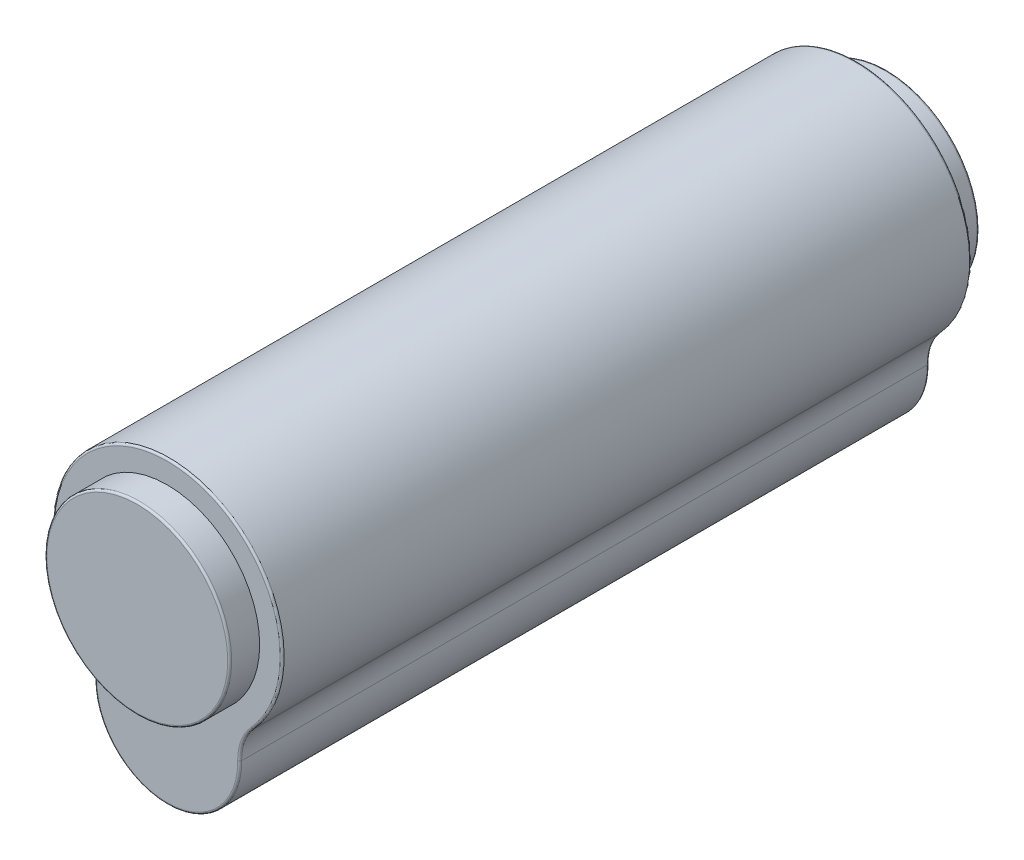
ISO-10303-21;
HEADER;
FILE_DESCRIPTION(('STEP AP214'),'2;1');
FILE_NAME('part.step','',(''),(''),'','','');
FILE_SCHEMA(('AUTOMOTIVE_DESIGN { 1 0 10303 214 1 1 1 1 }'));
ENDSEC;
DATA;
#1=APPLICATION_CONTEXT('core data for automotive mechanical design processes');
#2=APPLICATION_PROTOCOL_DEFINITION('international standard','automotive_design',2000,#1);
#3=PRODUCT_CONTEXT('',#1,'mechanical');
#4=PRODUCT('Part','Part','',(#3));
#5=PRODUCT_RELATED_PRODUCT_CATEGORY('part','',(#4));
#6=PRODUCT_DEFINITION_FORMATION('','',#4);
#7=PRODUCT_DEFINITION_CONTEXT('part definition',#1,'design');
#8=PRODUCT_DEFINITION('design','',#6,#7);
#9=PRODUCT_DEFINITION_SHAPE('','',#8);
#10=(LENGTH_UNIT() NAMED_UNIT(*) SI_UNIT(.MILLI.,.METRE.));
#11=(NAMED_UNIT(*) PLANE_ANGLE_UNIT() SI_UNIT($,.RADIAN.));
#12=(NAMED_UNIT(*) SI_UNIT($,.STERADIAN.) SOLID_ANGLE_UNIT());
#13=UNCERTAINTY_MEASURE_WITH_UNIT(LENGTH_MEASURE(1.E-05),#10,'distance_accuracy_value','');
#14=(GEOMETRIC_REPRESENTATION_CONTEXT(3) GLOBAL_UNCERTAINTY_ASSIGNED_CONTEXT((#13)) GLOBAL_UNIT_ASSIGNED_CONTEXT((#10,
#11,#12)) REPRESENTATION_CONTEXT('',''));
#15=CARTESIAN_POINT('',(0.,0.,0.));
#16=DIRECTION('',(0.,0.,1.));
#17=DIRECTION('',(1.,0.,0.));
#18=AXIS2_PLACEMENT_3D('',#15,#16,#17);
#19=CARTESIAN_POINT('',(-6.12422834645363,-5.52777777777778,0.));
#20=DIRECTION('',(0.,0.,1.));
#21=DIRECTION('',(1.,0.,0.));
#22=AXIS2_PLACEMENT_3D('',#19,#20,#21);
#23=PLANE('',#22);
#24=CARTESIAN_POINT('',(0.,0.,0.));
#25=DIRECTION('',(0.,0.,1.));
#26=DIRECTION('',(1.,0.,0.));
#27=AXIS2_PLACEMENT_3D('',#24,#25,#26);
#28=CIRCLE('',#27,11.3);
#29=CARTESIAN_POINT('',(-8.38833700786982,-7.57138047138047,0.));
#30=VERTEX_POINT('',#29);
#31=CARTESIAN_POINT('',(8.38833700786982,-7.57138047138047,0.));
#32=VERTEX_POINT('',#31);
#33=EDGE_CURVE('E253',#30,#32,#28,.F.);
#34=ORIENTED_EDGE('',*,*,#33,.T.);
#35=CARTESIAN_POINT('',(12.2484566929073,-11.0555555555556,0.));
#36=DIRECTION('',(0.,0.,1.));
#37=DIRECTION('',(1.,0.,0.));
#38=AXIS2_PLACEMENT_3D('',#35,#36,#37);
#39=CIRCLE('',#38,5.2);
#40=CARTESIAN_POINT('',(7.0491118110201,-11.1380952380952,0.));
#41=VERTEX_POINT('',#40);
#42=EDGE_CURVE('E259',#32,#41,#39,.T.);
#43=ORIENTED_EDGE('',*,*,#42,.T.);
#44=CARTESIAN_POINT('',(0.,-11.25,0.));
#45=DIRECTION('',(0.,0.,1.));
#46=DIRECTION('',(1.,0.,0.));
#47=AXIS2_PLACEMENT_3D('',#44,#45,#46);
#48=CIRCLE('',#47,7.05);
#49=CARTESIAN_POINT('',(-7.04911181102009,-11.1380952380952,0.));
#50=VERTEX_POINT('',#49);
#51=EDGE_CURVE('E257',#41,#50,#48,.F.);
#52=ORIENTED_EDGE('',*,*,#51,.T.);
#53=CARTESIAN_POINT('',(-12.2484566929073,-11.0555555555556,0.));
#54=DIRECTION('',(0.,0.,1.));
#55=DIRECTION('',(1.,0.,0.));
#56=AXIS2_PLACEMENT_3D('',#53,#54,#55);
#57=CIRCLE('',#56,5.2);
#58=EDGE_CURVE('E255',#50,#30,#57,.T.);
#59=ORIENTED_EDGE('',*,*,#58,.T.);
#60=EDGE_LOOP('',(#34,#43,#52,#59));
#61=FACE_BOUND('',#60,.T.);
#62=CARTESIAN_POINT('',(0.,0.,0.));
#63=DIRECTION('',(0.,0.,1.));
#64=DIRECTION('',(1.,0.,0.));
#65=AXIS2_PLACEMENT_3D('',#62,#63,#64);
#66=CIRCLE('',#65,9.25);
#67=CARTESIAN_POINT('',(9.25,0.,0.));
#68=VERTEX_POINT('',#67);
#69=EDGE_CURVE('E170',#68,#68,#66,.F.);
#70=ORIENTED_EDGE('',*,*,#69,.F.);
#71=EDGE_LOOP('',(#70));
#72=FACE_BOUND('',#71,.T.);
#73=ADVANCED_FACE('F35',(#61,#72),#23,.F.);
#74=CARTESIAN_POINT('',(-6.12422834645363,-5.52777777777778,69.));
#75=DIRECTION('',(0.,0.,1.));
#76=DIRECTION('',(1.,0.,0.));
#77=AXIS2_PLACEMENT_3D('',#74,#75,#76);
#78=PLANE('',#77);
#79=CARTESIAN_POINT('',(0.,-11.25,69.));
#80=DIRECTION('',(0.,0.,1.));
#81=DIRECTION('',(1.,0.,0.));
#82=AXIS2_PLACEMENT_3D('',#79,#80,#81);
#83=CIRCLE('',#82,7.05);
#84=CARTESIAN_POINT('',(-7.04911181102009,-11.1380952380952,69.));
#85=VERTEX_POINT('',#84);
#86=CARTESIAN_POINT('',(7.0491118110201,-11.1380952380952,69.));
#87=VERTEX_POINT('',#86);
#88=EDGE_CURVE('E86',#85,#87,#83,.T.);
#89=ORIENTED_EDGE('',*,*,#88,.T.);
#90=CARTESIAN_POINT('',(12.2484566929073,-11.0555555555556,69.));
#91=DIRECTION('',(0.,0.,1.));
#92=DIRECTION('',(1.,0.,0.));
#93=AXIS2_PLACEMENT_3D('',#90,#91,#92);
#94=CIRCLE('',#93,5.2);
#95=CARTESIAN_POINT('',(8.38833700786982,-7.57138047138047,69.));
#96=VERTEX_POINT('',#95);
#97=EDGE_CURVE('E273',#87,#96,#94,.F.);
#98=ORIENTED_EDGE('',*,*,#97,.T.);
#99=CARTESIAN_POINT('',(0.,0.,69.));
#100=DIRECTION('',(0.,0.,1.));
#101=DIRECTION('',(1.,0.,0.));
#102=AXIS2_PLACEMENT_3D('',#99,#100,#101);
#103=CIRCLE('',#102,11.3);
#104=CARTESIAN_POINT('',(-8.38833700786982,-7.57138047138047,69.));
#105=VERTEX_POINT('',#104);
#106=EDGE_CURVE('E173',#96,#105,#103,.T.);
#107=ORIENTED_EDGE('',*,*,#106,.T.);
#108=CARTESIAN_POINT('',(-12.2484566929073,-11.0555555555556,69.));
#109=DIRECTION('',(0.,0.,1.));
#110=DIRECTION('',(1.,0.,0.));
#111=AXIS2_PLACEMENT_3D('',#108,#109,#110);
#112=CIRCLE('',#111,5.2);
#113=EDGE_CURVE('E91',#105,#85,#112,.F.);
#114=ORIENTED_EDGE('',*,*,#113,.T.);
#115=EDGE_LOOP('',(#89,#98,#107,#114));
#116=FACE_BOUND('',#115,.T.);
#117=CARTESIAN_POINT('',(0.,0.,69.));
#118=DIRECTION('',(0.,0.,1.));
#119=DIRECTION('',(1.,0.,0.));
#120=AXIS2_PLACEMENT_3D('',#117,#118,#119);
#121=CIRCLE('',#120,9.25);
#122=CARTESIAN_POINT('',(9.25,0.,69.));
#123=VERTEX_POINT('',#122);
#124=EDGE_CURVE('E161',#123,#123,#121,.T.);
#125=ORIENTED_EDGE('',*,*,#124,.F.);
#126=EDGE_LOOP('',(#125));
#127=FACE_BOUND('',#126,.T.);
#128=ADVANCED_FACE('F296',(#116,#127),#78,.T.);
#129=CARTESIAN_POINT('',(0.,0.,69.));
#130=DIRECTION('',(0.,0.,-1.));
#131=DIRECTION('',(-1.,0.,0.));
#132=AXIS2_PLACEMENT_3D('',#129,#130,#131);
#133=CYLINDRICAL_SURFACE('',#132,11.5);
#134=DIRECTION('',(0.,0.,-1.));
#135=VECTOR('',#134,1.);
#136=CARTESIAN_POINT('',(8.53680314960203,-7.70538720538721,69.));
#137=LINE('',#136,#135);
#138=CARTESIAN_POINT('',(8.53680314960203,-7.70538720538721,68.8));
#139=VERTEX_POINT('',#138);
#140=CARTESIAN_POINT('',(8.53680314960203,-7.70538720538721,0.200000000000006));
#141=VERTEX_POINT('',#140);
#142=EDGE_CURVE('E140',#139,#141,#137,.T.);
#143=ORIENTED_EDGE('',*,*,#142,.T.);
#144=CARTESIAN_POINT('',(0.,0.,0.200000000000006));
#145=DIRECTION('',(0.,0.,1.));
#146=DIRECTION('',(1.,0.,0.));
#147=AXIS2_PLACEMENT_3D('',#144,#145,#146);
#148=CIRCLE('',#147,11.5);
#149=CARTESIAN_POINT('',(-8.53680314960203,-7.70538720538721,0.200000000000006));
#150=VERTEX_POINT('',#149);
#151=EDGE_CURVE('E147',#141,#150,#148,.T.);
#152=ORIENTED_EDGE('',*,*,#151,.T.);
#153=DIRECTION('',(0.,0.,-1.));
#154=VECTOR('',#153,1.);
#155=CARTESIAN_POINT('',(-8.53680314960203,-7.70538720538721,69.));
#156=LINE('',#155,#154);
#157=CARTESIAN_POINT('',(-8.53680314960203,-7.70538720538721,68.8));
#158=VERTEX_POINT('',#157);
#159=EDGE_CURVE('E142',#158,#150,#156,.T.);
#160=ORIENTED_EDGE('',*,*,#159,.F.);
#161=CARTESIAN_POINT('',(0.,0.,68.8));
#162=DIRECTION('',(0.,0.,1.));
#163=DIRECTION('',(1.,0.,0.));
#164=AXIS2_PLACEMENT_3D('',#161,#162,#163);
#165=CIRCLE('',#164,11.5);
#166=EDGE_CURVE('E137',#158,#139,#165,.F.);
#167=ORIENTED_EDGE('',*,*,#166,.T.);
#168=EDGE_LOOP('',(#143,#152,#160,#167));
#169=FACE_BOUND('',#168,.T.);
#170=ADVANCED_FACE('F139',(#169),#133,.T.);
#171=CARTESIAN_POINT('',(-12.2484566929073,-11.0555555555556,69.));
#172=DIRECTION('',(0.,0.,-1.));
#173=DIRECTION('',(-1.,0.,0.));
#174=AXIS2_PLACEMENT_3D('',#171,#172,#173);
#175=CYLINDRICAL_SURFACE('',#174,5.);
#176=ORIENTED_EDGE('',*,*,#159,.T.);
#177=CARTESIAN_POINT('',(-12.2484566929073,-11.0555555555556,0.200000000000006));
#178=DIRECTION('',(0.,0.,1.));
#179=DIRECTION('',(1.,0.,0.));
#180=AXIS2_PLACEMENT_3D('',#177,#178,#179);
#181=CIRCLE('',#180,5.);
#182=CARTESIAN_POINT('',(-7.2490866141696,-11.1349206349206,0.200000000000006));
#183=VERTEX_POINT('',#182);
#184=EDGE_CURVE('E268',#150,#183,#181,.F.);
#185=ORIENTED_EDGE('',*,*,#184,.T.);
#186=DIRECTION('',(0.,0.,-1.));
#187=VECTOR('',#186,1.);
#188=CARTESIAN_POINT('',(-7.2490866141696,-11.1349206349206,69.));
#189=LINE('',#188,#187);
#190=CARTESIAN_POINT('',(-7.2490866141696,-11.1349206349206,68.8));
#191=VERTEX_POINT('',#190);
#192=EDGE_CURVE('E246',#191,#183,#189,.T.);
#193=ORIENTED_EDGE('',*,*,#192,.F.);
#194=CARTESIAN_POINT('',(-12.2484566929073,-11.0555555555556,68.8));
#195=DIRECTION('',(0.,0.,1.));
#196=DIRECTION('',(1.,0.,0.));
#197=AXIS2_PLACEMENT_3D('',#194,#195,#196);
#198=CIRCLE('',#197,5.);
#199=EDGE_CURVE('E266',#191,#158,#198,.T.);
#200=ORIENTED_EDGE('',*,*,#199,.T.);
#201=EDGE_LOOP('',(#176,#185,#193,#200));
#202=FACE_BOUND('',#201,.T.);
#203=ADVANCED_FACE('F282',(#202),#175,.F.);
#204=CARTESIAN_POINT('',(0.,-11.25,69.));
#205=DIRECTION('',(0.,0.,-1.));
#206=DIRECTION('',(-1.,0.,0.));
#207=AXIS2_PLACEMENT_3D('',#204,#205,#206);
#208=CYLINDRICAL_SURFACE('',#207,7.25);
#209=ORIENTED_EDGE('',*,*,#192,.T.);
#210=CARTESIAN_POINT('',(0.,-11.25,0.200000000000006));
#211=DIRECTION('',(0.,0.,1.));
#212=DIRECTION('',(1.,0.,0.));
#213=AXIS2_PLACEMENT_3D('',#210,#211,#212);
#214=CIRCLE('',#213,7.25);
#215=CARTESIAN_POINT('',(7.2490866141696,-11.1349206349206,0.200000000000006));
#216=VERTEX_POINT('',#215);
#217=EDGE_CURVE('E264',#183,#216,#214,.T.);
#218=ORIENTED_EDGE('',*,*,#217,.T.);
#219=DIRECTION('',(0.,0.,-1.));
#220=VECTOR('',#219,1.);
#221=CARTESIAN_POINT('',(7.2490866141696,-11.1349206349206,69.));
#222=LINE('',#221,#220);
#223=CARTESIAN_POINT('',(7.2490866141696,-11.1349206349206,68.8));
#224=VERTEX_POINT('',#223);
#225=EDGE_CURVE('E160',#224,#216,#222,.T.);
#226=ORIENTED_EDGE('',*,*,#225,.F.);
#227=CARTESIAN_POINT('',(0.,-11.25,68.8));
#228=DIRECTION('',(0.,0.,1.));
#229=DIRECTION('',(1.,0.,0.));
#230=AXIS2_PLACEMENT_3D('',#227,#228,#229);
#231=CIRCLE('',#230,7.25);
#232=EDGE_CURVE('E262',#224,#191,#231,.F.);
#233=ORIENTED_EDGE('',*,*,#232,.T.);
#234=EDGE_LOOP('',(#209,#218,#226,#233));
#235=FACE_BOUND('',#234,.T.);
#236=ADVANCED_FACE('F291',(#235),#208,.T.);
#237=CARTESIAN_POINT('',(12.2484566929073,-11.0555555555556,69.));
#238=DIRECTION('',(0.,0.,-1.));
#239=DIRECTION('',(-1.,0.,0.));
#240=AXIS2_PLACEMENT_3D('',#237,#238,#239);
#241=CYLINDRICAL_SURFACE('',#240,5.);
#242=ORIENTED_EDGE('',*,*,#225,.T.);
#243=CARTESIAN_POINT('',(12.2484566929073,-11.0555555555556,0.200000000000006));
#244=DIRECTION('',(0.,0.,1.));
#245=DIRECTION('',(1.,0.,0.));
#246=AXIS2_PLACEMENT_3D('',#243,#244,#245);
#247=CIRCLE('',#246,5.);
#248=EDGE_CURVE('E159',#216,#141,#247,.F.);
#249=ORIENTED_EDGE('',*,*,#248,.T.);
#250=ORIENTED_EDGE('',*,*,#142,.F.);
#251=CARTESIAN_POINT('',(12.2484566929073,-11.0555555555556,68.8));
#252=DIRECTION('',(0.,0.,1.));
#253=DIRECTION('',(1.,0.,0.));
#254=AXIS2_PLACEMENT_3D('',#251,#252,#253);
#255=CIRCLE('',#254,5.);
#256=EDGE_CURVE('E156',#139,#224,#255,.T.);
#257=ORIENTED_EDGE('',*,*,#256,.T.);
#258=EDGE_LOOP('',(#242,#249,#250,#257));
#259=FACE_BOUND('',#258,.T.);
#260=ADVANCED_FACE('F155',(#259),#241,.F.);
#261=CARTESIAN_POINT('',(0.,0.,72.));
#262=DIRECTION('',(0.,0.,-1.));
#263=DIRECTION('',(-1.,0.,0.));
#264=AXIS2_PLACEMENT_3D('',#261,#262,#263);
#265=CYLINDRICAL_SURFACE('',#264,9.25);
#266=CARTESIAN_POINT('',(0.,0.,71.8));
#267=DIRECTION('',(0.,0.,1.));
#268=DIRECTION('',(1.,0.,0.));
#269=AXIS2_PLACEMENT_3D('',#266,#267,#268);
#270=CIRCLE('',#269,9.25);
#271=CARTESIAN_POINT('',(9.25,0.,71.8));
#272=VERTEX_POINT('',#271);
#273=EDGE_CURVE('E217',#272,#272,#270,.F.);
#274=ORIENTED_EDGE('',*,*,#273,.T.);
#275=EDGE_LOOP('',(#274));
#276=FACE_BOUND('',#275,.T.);
#277=ORIENTED_EDGE('',*,*,#124,.T.);
#278=EDGE_LOOP('',(#277));
#279=FACE_BOUND('',#278,.T.);
#280=ADVANCED_FACE('F308',(#276,#279),#265,.T.);
#281=CARTESIAN_POINT('',(0.,0.,72.));
#282=DIRECTION('',(0.,0.,1.));
#283=DIRECTION('',(1.,0.,0.));
#284=AXIS2_PLACEMENT_3D('',#281,#282,#283);
#285=PLANE('',#284);
#286=CARTESIAN_POINT('',(0.,0.,72.));
#287=DIRECTION('',(0.,0.,1.));
#288=DIRECTION('',(1.,0.,0.));
#289=AXIS2_PLACEMENT_3D('',#286,#287,#288);
#290=CIRCLE('',#289,9.05);
#291=CARTESIAN_POINT('',(9.05,0.,72.));
#292=VERTEX_POINT('',#291);
#293=EDGE_CURVE('E219',#292,#292,#290,.T.);
#294=ORIENTED_EDGE('',*,*,#293,.T.);
#295=EDGE_LOOP('',(#294));
#296=FACE_BOUND('',#295,.T.);
#297=ADVANCED_FACE('F534',(#296),#285,.T.);
#298=CARTESIAN_POINT('',(0.,0.,-3.));
#299=DIRECTION('',(0.,0.,1.));
#300=DIRECTION('',(1.,0.,0.));
#301=AXIS2_PLACEMENT_3D('',#298,#299,#300);
#302=CYLINDRICAL_SURFACE('',#301,9.25);
#303=CARTESIAN_POINT('',(0.,0.,-2.8));
#304=DIRECTION('',(0.,0.,-1.));
#305=DIRECTION('',(-1.,0.,0.));
#306=AXIS2_PLACEMENT_3D('',#303,#304,#305);
#307=CIRCLE('',#306,9.25);
#308=CARTESIAN_POINT('',(-9.25,0.,-2.8));
#309=VERTEX_POINT('',#308);
#310=EDGE_CURVE('E148',#309,#309,#307,.F.);
#311=ORIENTED_EDGE('',*,*,#310,.T.);
#312=EDGE_LOOP('',(#311));
#313=FACE_BOUND('',#312,.T.);
#314=ORIENTED_EDGE('',*,*,#69,.T.);
#315=EDGE_LOOP('',(#314));
#316=FACE_BOUND('',#315,.T.);
#317=ADVANCED_FACE('F521',(#313,#316),#302,.T.);
#318=CARTESIAN_POINT('',(0.,0.,-3.));
#319=DIRECTION('',(0.,0.,-1.));
#320=DIRECTION('',(-1.,0.,0.));
#321=AXIS2_PLACEMENT_3D('',#318,#319,#320);
#322=PLANE('',#321);
#323=CARTESIAN_POINT('',(0.,0.,-3.));
#324=DIRECTION('',(0.,0.,-1.));
#325=DIRECTION('',(-1.,0.,0.));
#326=AXIS2_PLACEMENT_3D('',#323,#324,#325);
#327=CIRCLE('',#326,9.05);
#328=CARTESIAN_POINT('',(-9.05,0.,-3.));
#329=VERTEX_POINT('',#328);
#330=EDGE_CURVE('E275',#329,#329,#327,.T.);
#331=ORIENTED_EDGE('',*,*,#330,.T.);
#332=EDGE_LOOP('',(#331));
#333=FACE_BOUND('',#332,.T.);
#334=ADVANCED_FACE('F328',(#333),#322,.T.);
#335=CARTESIAN_POINT('',(-12.2484566929073,-11.0555555555556,0.200000000000006));
#336=DIRECTION('',(0.,0.,1.));
#337=DIRECTION('',(1.,0.,0.));
#338=AXIS2_PLACEMENT_3D('',#335,#336,#337);
#339=TOROIDAL_SURFACE('',#338,5.2,0.2);
#340=CARTESIAN_POINT('',(-8.38833700786982,-7.57138047138047,0.2));
#341=DIRECTION('',(-0.670033670033669,0.742330708661047,0.));
#342=DIRECTION('',(-0.742330708661047,-0.670033670033669,0.));
#343=AXIS2_PLACEMENT_3D('',#340,#341,#342);
#344=CIRCLE('',#343,0.2);
#345=EDGE_CURVE('E229',#30,#150,#344,.T.);
#346=ORIENTED_EDGE('',*,*,#345,.F.);
#347=ORIENTED_EDGE('',*,*,#58,.F.);
#348=CARTESIAN_POINT('',(-7.04911181102009,-11.1380952380952,0.200000000000006));
#349=DIRECTION('',(-0.0158730158730195,-0.999874015747531,0.));
#350=DIRECTION('',(0.999874015747532,-0.0158730158730195,0.));
#351=AXIS2_PLACEMENT_3D('',#348,#349,#350);
#352=CIRCLE('',#351,0.2);
#353=EDGE_CURVE('E178',#183,#50,#352,.T.);
#354=ORIENTED_EDGE('',*,*,#353,.F.);
#355=ORIENTED_EDGE('',*,*,#184,.F.);
#356=EDGE_LOOP('',(#346,#347,#354,#355));
#357=FACE_BOUND('',#356,.T.);
#358=ADVANCED_FACE('F286',(#357),#339,.T.);
#359=CARTESIAN_POINT('',(0.,-11.25,0.200000000000006));
#360=DIRECTION('',(0.,0.,1.));
#361=DIRECTION('',(1.,0.,0.));
#362=AXIS2_PLACEMENT_3D('',#359,#360,#361);
#363=TOROIDAL_SURFACE('',#362,7.05,0.2);
#364=ORIENTED_EDGE('',*,*,#353,.T.);
#365=ORIENTED_EDGE('',*,*,#51,.F.);
#366=CARTESIAN_POINT('',(7.0491118110201,-11.1380952380952,0.200000000000006));
#367=DIRECTION('',(-0.0158730158730195,0.999874015747531,0.));
#368=DIRECTION('',(-0.999874015747532,-0.0158730158730195,0.));
#369=AXIS2_PLACEMENT_3D('',#366,#367,#368);
#370=CIRCLE('',#369,0.2);
#371=EDGE_CURVE('E228',#216,#41,#370,.T.);
#372=ORIENTED_EDGE('',*,*,#371,.F.);
#373=ORIENTED_EDGE('',*,*,#217,.F.);
#374=EDGE_LOOP('',(#364,#365,#372,#373));
#375=FACE_BOUND('',#374,.T.);
#376=ADVANCED_FACE('F289',(#375),#363,.T.);
#377=CARTESIAN_POINT('',(0.,0.,0.200000000000006));
#378=DIRECTION('',(0.,0.,1.));
#379=DIRECTION('',(1.,0.,0.));
#380=AXIS2_PLACEMENT_3D('',#377,#378,#379);
#381=TOROIDAL_SURFACE('',#380,11.3,0.2);
#382=ORIENTED_EDGE('',*,*,#345,.T.);
#383=ORIENTED_EDGE('',*,*,#151,.F.);
#384=CARTESIAN_POINT('',(8.38833700786982,-7.57138047138047,0.2));
#385=DIRECTION('',(-0.670033670033668,-0.742330708661048,0.));
#386=DIRECTION('',(0.742330708661048,-0.670033670033668,0.));
#387=AXIS2_PLACEMENT_3D('',#384,#385,#386);
#388=CIRCLE('',#387,0.2);
#389=EDGE_CURVE('E184',#32,#141,#388,.T.);
#390=ORIENTED_EDGE('',*,*,#389,.F.);
#391=ORIENTED_EDGE('',*,*,#33,.F.);
#392=EDGE_LOOP('',(#382,#383,#390,#391));
#393=FACE_BOUND('',#392,.T.);
#394=ADVANCED_FACE('F320',(#393),#381,.T.);
#395=CARTESIAN_POINT('',(12.2484566929073,-11.0555555555556,0.200000000000006));
#396=DIRECTION('',(0.,0.,1.));
#397=DIRECTION('',(1.,0.,0.));
#398=AXIS2_PLACEMENT_3D('',#395,#396,#397);
#399=TOROIDAL_SURFACE('',#398,5.2,0.2);
#400=ORIENTED_EDGE('',*,*,#371,.T.);
#401=ORIENTED_EDGE('',*,*,#42,.F.);
#402=ORIENTED_EDGE('',*,*,#389,.T.);
#403=ORIENTED_EDGE('',*,*,#248,.F.);
#404=EDGE_LOOP('',(#400,#401,#402,#403));
#405=FACE_BOUND('',#404,.T.);
#406=ADVANCED_FACE('F317',(#405),#399,.T.);
#407=CARTESIAN_POINT('',(-12.2484566929073,-11.0555555555556,68.8));
#408=DIRECTION('',(0.,0.,1.));
#409=DIRECTION('',(1.,0.,0.));
#410=AXIS2_PLACEMENT_3D('',#407,#408,#409);
#411=TOROIDAL_SURFACE('',#410,5.2,0.2);
#412=CARTESIAN_POINT('',(-8.38833700786982,-7.57138047138047,68.8));
#413=DIRECTION('',(-0.670033670033669,0.742330708661047,0.));
#414=DIRECTION('',(-0.742330708661047,-0.67003367003367,0.));
#415=AXIS2_PLACEMENT_3D('',#412,#413,#414);
#416=CIRCLE('',#415,0.2);
#417=EDGE_CURVE('E175',#158,#105,#416,.T.);
#418=ORIENTED_EDGE('',*,*,#417,.F.);
#419=ORIENTED_EDGE('',*,*,#199,.F.);
#420=CARTESIAN_POINT('',(-7.04911181102009,-11.1380952380952,68.8));
#421=DIRECTION('',(-0.0158730158730195,-0.999874015747531,0.));
#422=DIRECTION('',(0.999874015747532,-0.0158730158730196,0.));
#423=AXIS2_PLACEMENT_3D('',#420,#421,#422);
#424=CIRCLE('',#423,0.2);
#425=EDGE_CURVE('E182',#85,#191,#424,.T.);
#426=ORIENTED_EDGE('',*,*,#425,.F.);
#427=ORIENTED_EDGE('',*,*,#113,.F.);
#428=EDGE_LOOP('',(#418,#419,#426,#427));
#429=FACE_BOUND('',#428,.T.);
#430=ADVANCED_FACE('F293',(#429),#411,.T.);
#431=CARTESIAN_POINT('',(0.,-11.25,68.8));
#432=DIRECTION('',(0.,0.,1.));
#433=DIRECTION('',(1.,0.,0.));
#434=AXIS2_PLACEMENT_3D('',#431,#432,#433);
#435=TOROIDAL_SURFACE('',#434,7.05,0.2);
#436=ORIENTED_EDGE('',*,*,#425,.T.);
#437=ORIENTED_EDGE('',*,*,#232,.F.);
#438=CARTESIAN_POINT('',(7.0491118110201,-11.1380952380952,68.8));
#439=DIRECTION('',(-0.0158730158730195,0.999874015747531,0.));
#440=DIRECTION('',(-0.999874015747532,-0.0158730158730196,0.));
#441=AXIS2_PLACEMENT_3D('',#438,#439,#440);
#442=CIRCLE('',#441,0.2);
#443=EDGE_CURVE('E168',#87,#224,#442,.T.);
#444=ORIENTED_EDGE('',*,*,#443,.F.);
#445=ORIENTED_EDGE('',*,*,#88,.F.);
#446=EDGE_LOOP('',(#436,#437,#444,#445));
#447=FACE_BOUND('',#446,.T.);
#448=ADVANCED_FACE('F295',(#447),#435,.T.);
#449=CARTESIAN_POINT('',(0.,0.,68.8));
#450=DIRECTION('',(0.,0.,1.));
#451=DIRECTION('',(1.,0.,0.));
#452=AXIS2_PLACEMENT_3D('',#449,#450,#451);
#453=TOROIDAL_SURFACE('',#452,11.3,0.2);
#454=ORIENTED_EDGE('',*,*,#417,.T.);
#455=ORIENTED_EDGE('',*,*,#106,.F.);
#456=CARTESIAN_POINT('',(8.38833700786982,-7.57138047138047,68.8));
#457=DIRECTION('',(-0.670033670033669,-0.742330708661047,0.));
#458=DIRECTION('',(0.742330708661047,-0.67003367003367,0.));
#459=AXIS2_PLACEMENT_3D('',#456,#457,#458);
#460=CIRCLE('',#459,0.2);
#461=EDGE_CURVE('E166',#139,#96,#460,.T.);
#462=ORIENTED_EDGE('',*,*,#461,.F.);
#463=ORIENTED_EDGE('',*,*,#166,.F.);
#464=EDGE_LOOP('',(#454,#455,#462,#463));
#465=FACE_BOUND('',#464,.T.);
#466=ADVANCED_FACE('F172',(#465),#453,.T.);
#467=CARTESIAN_POINT('',(12.2484566929073,-11.0555555555556,68.8));
#468=DIRECTION('',(0.,0.,1.));
#469=DIRECTION('',(1.,0.,0.));
#470=AXIS2_PLACEMENT_3D('',#467,#468,#469);
#471=TOROIDAL_SURFACE('',#470,5.2,0.2);
#472=ORIENTED_EDGE('',*,*,#443,.T.);
#473=ORIENTED_EDGE('',*,*,#256,.F.);
#474=ORIENTED_EDGE('',*,*,#461,.T.);
#475=ORIENTED_EDGE('',*,*,#97,.F.);
#476=EDGE_LOOP('',(#472,#473,#474,#475));
#477=FACE_BOUND('',#476,.T.);
#478=ADVANCED_FACE('F164',(#477),#471,.T.);
#479=CARTESIAN_POINT('',(0.,0.,-2.8));
#480=DIRECTION('',(0.,0.,-1.));
#481=DIRECTION('',(-1.,0.,0.));
#482=AXIS2_PLACEMENT_3D('',#479,#480,#481);
#483=TOROIDAL_SURFACE('',#482,9.05,0.2);
#484=ORIENTED_EDGE('',*,*,#310,.F.);
#485=EDGE_LOOP('',(#484));
#486=FACE_BOUND('',#485,.T.);
#487=ORIENTED_EDGE('',*,*,#330,.F.);
#488=EDGE_LOOP('',(#487));
#489=FACE_BOUND('',#488,.T.);
#490=ADVANCED_FACE('F331',(#486,#489),#483,.T.);
#491=CARTESIAN_POINT('',(0.,0.,71.8));
#492=DIRECTION('',(0.,0.,1.));
#493=DIRECTION('',(1.,0.,0.));
#494=AXIS2_PLACEMENT_3D('',#491,#492,#493);
#495=TOROIDAL_SURFACE('',#494,9.05,0.2);
#496=ORIENTED_EDGE('',*,*,#273,.F.);
#497=EDGE_LOOP('',(#496));
#498=FACE_BOUND('',#497,.T.);
#499=ORIENTED_EDGE('',*,*,#293,.F.);
#500=EDGE_LOOP('',(#499));
#501=FACE_BOUND('',#500,.T.);
#502=ADVANCED_FACE('F340',(#498,#501),#495,.T.);
#503=CLOSED_SHELL('',(#73,#128,#170,#203,#236,#260,#280,#297,#317,#334,#358,#376,#394,#406,#430,
#448,#466,#478,#490,#502));
#504=CARTESIAN_POINT('',(-6.12422834645363,-5.52777777777778,1.));
#505=DIRECTION('',(0.,0.,1.));
#506=DIRECTION('',(1.,0.,0.));
#507=AXIS2_PLACEMENT_3D('',#504,#505,#506);
#508=PLANE('',#507);
#509=CARTESIAN_POINT('',(0.,0.,1.));
#510=DIRECTION('',(0.,0.,1.));
#511=DIRECTION('',(1.,0.,0.));
#512=AXIS2_PLACEMENT_3D('',#509,#510,#511);
#513=CIRCLE('',#512,10.5);
#514=CARTESIAN_POINT('',(7.79447244094099,-7.03535353535353,1.));
#515=VERTEX_POINT('',#514);
#516=CARTESIAN_POINT('',(-7.79447244094098,-7.03535353535353,1.));
#517=VERTEX_POINT('',#516);
#518=EDGE_CURVE('E208',#515,#517,#513,.T.);
#519=ORIENTED_EDGE('',*,*,#518,.T.);
#520=CARTESIAN_POINT('',(-12.2484566929073,-11.0555555555556,1.));
#521=DIRECTION('',(0.,0.,1.));
#522=DIRECTION('',(1.,0.,0.));
#523=AXIS2_PLACEMENT_3D('',#520,#521,#522);
#524=CIRCLE('',#523,6.);
#525=CARTESIAN_POINT('',(-6.24921259842207,-11.1507936507936,1.));
#526=VERTEX_POINT('',#525);
#527=EDGE_CURVE('E215',#526,#517,#524,.T.);
#528=ORIENTED_EDGE('',*,*,#527,.F.);
#529=CARTESIAN_POINT('',(0.,-11.25,1.));
#530=DIRECTION('',(0.,0.,1.));
#531=DIRECTION('',(1.,0.,0.));
#532=AXIS2_PLACEMENT_3D('',#529,#530,#531);
#533=CIRCLE('',#532,6.25);
#534=CARTESIAN_POINT('',(6.24921259842207,-11.1507936507937,1.));
#535=VERTEX_POINT('',#534);
#536=EDGE_CURVE('E77',#535,#526,#533,.F.);
#537=ORIENTED_EDGE('',*,*,#536,.F.);
#538=CARTESIAN_POINT('',(12.2484566929073,-11.0555555555556,1.));
#539=DIRECTION('',(0.,0.,1.));
#540=DIRECTION('',(1.,0.,0.));
#541=AXIS2_PLACEMENT_3D('',#538,#539,#540);
#542=CIRCLE('',#541,6.);
#543=EDGE_CURVE('E39',#515,#535,#542,.T.);
#544=ORIENTED_EDGE('',*,*,#543,.F.);
#545=EDGE_LOOP('',(#519,#528,#537,#544));
#546=FACE_BOUND('',#545,.T.);
#547=CARTESIAN_POINT('',(0.,0.,1.));
#548=DIRECTION('',(0.,0.,1.));
#549=DIRECTION('',(1.,0.,0.));
#550=AXIS2_PLACEMENT_3D('',#547,#548,#549);
#551=CIRCLE('',#550,8.25);
#552=CARTESIAN_POINT('',(8.25,0.,1.));
#553=VERTEX_POINT('',#552);
#554=EDGE_CURVE('E46',#553,#553,#551,.F.);
#555=ORIENTED_EDGE('',*,*,#554,.T.);
#556=EDGE_LOOP('',(#555));
#557=FACE_BOUND('',#556,.T.);
#558=ADVANCED_FACE('F345',(#546,#557),#508,.T.);
#559=CARTESIAN_POINT('',(-6.12422834645363,-5.52777777777778,68.));
#560=DIRECTION('',(0.,0.,1.));
#561=DIRECTION('',(1.,0.,0.));
#562=AXIS2_PLACEMENT_3D('',#559,#560,#561);
#563=PLANE('',#562);
#564=CARTESIAN_POINT('',(0.,-11.25,68.));
#565=DIRECTION('',(0.,0.,1.));
#566=DIRECTION('',(1.,0.,0.));
#567=AXIS2_PLACEMENT_3D('',#564,#565,#566);
#568=CIRCLE('',#567,6.25);
#569=CARTESIAN_POINT('',(6.24921259842207,-11.1507936507937,68.));
#570=VERTEX_POINT('',#569);
#571=CARTESIAN_POINT('',(-6.24921259842207,-11.1507936507936,68.));
#572=VERTEX_POINT('',#571);
#573=EDGE_CURVE('E197',#570,#572,#568,.F.);
#574=ORIENTED_EDGE('',*,*,#573,.T.);
#575=CARTESIAN_POINT('',(-12.2484566929073,-11.0555555555556,68.));
#576=DIRECTION('',(0.,0.,1.));
#577=DIRECTION('',(1.,0.,0.));
#578=AXIS2_PLACEMENT_3D('',#575,#576,#577);
#579=CIRCLE('',#578,6.);
#580=CARTESIAN_POINT('',(-7.79447244094098,-7.03535353535353,68.));
#581=VERTEX_POINT('',#580);
#582=EDGE_CURVE('E203',#572,#581,#579,.T.);
#583=ORIENTED_EDGE('',*,*,#582,.T.);
#584=CARTESIAN_POINT('',(0.,0.,68.));
#585=DIRECTION('',(0.,0.,1.));
#586=DIRECTION('',(1.,0.,0.));
#587=AXIS2_PLACEMENT_3D('',#584,#585,#586);
#588=CIRCLE('',#587,10.5);
#589=CARTESIAN_POINT('',(7.79447244094099,-7.03535353535353,68.));
#590=VERTEX_POINT('',#589);
#591=EDGE_CURVE('E213',#590,#581,#588,.T.);
#592=ORIENTED_EDGE('',*,*,#591,.F.);
#593=CARTESIAN_POINT('',(12.2484566929073,-11.0555555555556,68.));
#594=DIRECTION('',(0.,0.,1.));
#595=DIRECTION('',(1.,0.,0.));
#596=AXIS2_PLACEMENT_3D('',#593,#594,#595);
#597=CIRCLE('',#596,6.);
#598=EDGE_CURVE('E194',#590,#570,#597,.T.);
#599=ORIENTED_EDGE('',*,*,#598,.T.);
#600=EDGE_LOOP('',(#574,#583,#592,#599));
#601=FACE_BOUND('',#600,.T.);
#602=CARTESIAN_POINT('',(0.,0.,68.));
#603=DIRECTION('',(0.,0.,1.));
#604=DIRECTION('',(1.,0.,0.));
#605=AXIS2_PLACEMENT_3D('',#602,#603,#604);
#606=CIRCLE('',#605,8.25);
#607=CARTESIAN_POINT('',(8.25,0.,68.));
#608=VERTEX_POINT('',#607);
#609=EDGE_CURVE('E191',#608,#608,#606,.T.);
#610=ORIENTED_EDGE('',*,*,#609,.T.);
#611=EDGE_LOOP('',(#610));
#612=FACE_BOUND('',#611,.T.);
#613=ADVANCED_FACE('F348',(#601,#612),#563,.F.);
#614=CARTESIAN_POINT('',(0.,0.,69.));
#615=DIRECTION('',(0.,0.,-1.));
#616=DIRECTION('',(-1.,0.,0.));
#617=AXIS2_PLACEMENT_3D('',#614,#615,#616);
#618=CYLINDRICAL_SURFACE('',#617,10.5);
#619=DIRECTION('',(0.,0.,-1.));
#620=VECTOR('',#619,1.);
#621=CARTESIAN_POINT('',(7.79447244094099,-7.03535353535353,69.));
#622=LINE('',#621,#620);
#623=EDGE_CURVE('E211',#590,#515,#622,.T.);
#624=ORIENTED_EDGE('',*,*,#623,.F.);
#625=ORIENTED_EDGE('',*,*,#591,.T.);
#626=DIRECTION('',(0.,0.,-1.));
#627=VECTOR('',#626,1.);
#628=CARTESIAN_POINT('',(-7.79447244094098,-7.03535353535353,69.));
#629=LINE('',#628,#627);
#630=EDGE_CURVE('E206',#581,#517,#629,.T.);
#631=ORIENTED_EDGE('',*,*,#630,.T.);
#632=ORIENTED_EDGE('',*,*,#518,.F.);
#633=EDGE_LOOP('',(#624,#625,#631,#632));
#634=FACE_BOUND('',#633,.T.);
#635=ADVANCED_FACE('F353',(#634),#618,.F.);
#636=CARTESIAN_POINT('',(-12.2484566929073,-11.0555555555556,69.));
#637=DIRECTION('',(0.,0.,-1.));
#638=DIRECTION('',(-1.,0.,0.));
#639=AXIS2_PLACEMENT_3D('',#636,#637,#638);
#640=CYLINDRICAL_SURFACE('',#639,6.);
#641=ORIENTED_EDGE('',*,*,#630,.F.);
#642=ORIENTED_EDGE('',*,*,#582,.F.);
#643=DIRECTION('',(0.,0.,-1.));
#644=VECTOR('',#643,1.);
#645=CARTESIAN_POINT('',(-6.24921259842207,-11.1507936507936,69.));
#646=LINE('',#645,#644);
#647=EDGE_CURVE('E200',#572,#526,#646,.T.);
#648=ORIENTED_EDGE('',*,*,#647,.T.);
#649=ORIENTED_EDGE('',*,*,#527,.T.);
#650=EDGE_LOOP('',(#641,#642,#648,#649));
#651=FACE_BOUND('',#650,.T.);
#652=ADVANCED_FACE('F357',(#651),#640,.T.);
#653=CARTESIAN_POINT('',(0.,-11.25,69.));
#654=DIRECTION('',(0.,0.,-1.));
#655=DIRECTION('',(-1.,0.,0.));
#656=AXIS2_PLACEMENT_3D('',#653,#654,#655);
#657=CYLINDRICAL_SURFACE('',#656,6.25);
#658=ORIENTED_EDGE('',*,*,#647,.F.);
#659=ORIENTED_EDGE('',*,*,#573,.F.);
#660=DIRECTION('',(0.,0.,-1.));
#661=VECTOR('',#660,1.);
#662=CARTESIAN_POINT('',(6.24921259842207,-11.1507936507937,69.));
#663=LINE('',#662,#661);
#664=EDGE_CURVE('E55',#570,#535,#663,.T.);
#665=ORIENTED_EDGE('',*,*,#664,.T.);
#666=ORIENTED_EDGE('',*,*,#536,.T.);
#667=EDGE_LOOP('',(#658,#659,#665,#666));
#668=FACE_BOUND('',#667,.T.);
#669=ADVANCED_FACE('F361',(#668),#657,.F.);
#670=CARTESIAN_POINT('',(12.2484566929073,-11.0555555555556,69.));
#671=DIRECTION('',(0.,0.,-1.));
#672=DIRECTION('',(-1.,0.,0.));
#673=AXIS2_PLACEMENT_3D('',#670,#671,#672);
#674=CYLINDRICAL_SURFACE('',#673,6.);
#675=ORIENTED_EDGE('',*,*,#664,.F.);
#676=ORIENTED_EDGE('',*,*,#598,.F.);
#677=ORIENTED_EDGE('',*,*,#623,.T.);
#678=ORIENTED_EDGE('',*,*,#543,.T.);
#679=EDGE_LOOP('',(#675,#676,#677,#678));
#680=FACE_BOUND('',#679,.T.);
#681=ADVANCED_FACE('F365',(#680),#674,.T.);
#682=CARTESIAN_POINT('',(0.,0.,72.));
#683=DIRECTION('',(0.,0.,-1.));
#684=DIRECTION('',(-1.,0.,0.));
#685=AXIS2_PLACEMENT_3D('',#682,#683,#684);
#686=CYLINDRICAL_SURFACE('',#685,8.25);
#687=CARTESIAN_POINT('',(0.,0.,71.));
#688=DIRECTION('',(0.,0.,1.));
#689=DIRECTION('',(1.,0.,0.));
#690=AXIS2_PLACEMENT_3D('',#687,#688,#689);
#691=CIRCLE('',#690,8.25);
#692=CARTESIAN_POINT('',(8.25,0.,71.));
#693=VERTEX_POINT('',#692);
#694=EDGE_CURVE('E188',#693,#693,#691,.T.);
#695=ORIENTED_EDGE('',*,*,#694,.T.);
#696=EDGE_LOOP('',(#695));
#697=FACE_BOUND('',#696,.T.);
#698=ORIENTED_EDGE('',*,*,#609,.F.);
#699=EDGE_LOOP('',(#698));
#700=FACE_BOUND('',#699,.T.);
#701=ADVANCED_FACE('F368',(#697,#700),#686,.F.);
#702=CARTESIAN_POINT('',(0.,0.,71.));
#703=DIRECTION('',(0.,0.,1.));
#704=DIRECTION('',(1.,0.,0.));
#705=AXIS2_PLACEMENT_3D('',#702,#703,#704);
#706=PLANE('',#705);
#707=ORIENTED_EDGE('',*,*,#694,.F.);
#708=EDGE_LOOP('',(#707));
#709=FACE_BOUND('',#708,.T.);
#710=ADVANCED_FACE('F371',(#709),#706,.F.);
#711=CARTESIAN_POINT('',(0.,0.,-3.));
#712=DIRECTION('',(0.,0.,1.));
#713=DIRECTION('',(1.,0.,0.));
#714=AXIS2_PLACEMENT_3D('',#711,#712,#713);
#715=CYLINDRICAL_SURFACE('',#714,8.25);
#716=CARTESIAN_POINT('',(0.,0.,-2.));
#717=DIRECTION('',(0.,0.,-1.));
#718=DIRECTION('',(-1.,0.,0.));
#719=AXIS2_PLACEMENT_3D('',#716,#717,#718);
#720=CIRCLE('',#719,8.25);
#721=CARTESIAN_POINT('',(-8.25,0.,-2.));
#722=VERTEX_POINT('',#721);
#723=EDGE_CURVE('E11',#722,#722,#720,.T.);
#724=ORIENTED_EDGE('',*,*,#723,.T.);
#725=EDGE_LOOP('',(#724));
#726=FACE_BOUND('',#725,.T.);
#727=ORIENTED_EDGE('',*,*,#554,.F.);
#728=EDGE_LOOP('',(#727));
#729=FACE_BOUND('',#728,.T.);
#730=ADVANCED_FACE('F374',(#726,#729),#715,.F.);
#731=CARTESIAN_POINT('',(0.,0.,-2.));
#732=DIRECTION('',(0.,0.,-1.));
#733=DIRECTION('',(-1.,0.,0.));
#734=AXIS2_PLACEMENT_3D('',#731,#732,#733);
#735=PLANE('',#734);
#736=ORIENTED_EDGE('',*,*,#723,.F.);
#737=EDGE_LOOP('',(#736));
#738=FACE_BOUND('',#737,.T.);
#739=ADVANCED_FACE('F37',(#738),#735,.F.);
#740=CLOSED_SHELL('',(#558,#613,#635,#652,#669,#681,#701,#710,#730,#739));
#741=ORIENTED_CLOSED_SHELL('',*,#740,.T.);
#742=BREP_WITH_VOIDS('B2',#503,(#741));
#743=ADVANCED_BREP_SHAPE_REPRESENTATION('',(#18,#742),#14);
#744=SHAPE_DEFINITION_REPRESENTATION(#9,#743);
ENDSEC;
END-ISO-10303-21;
